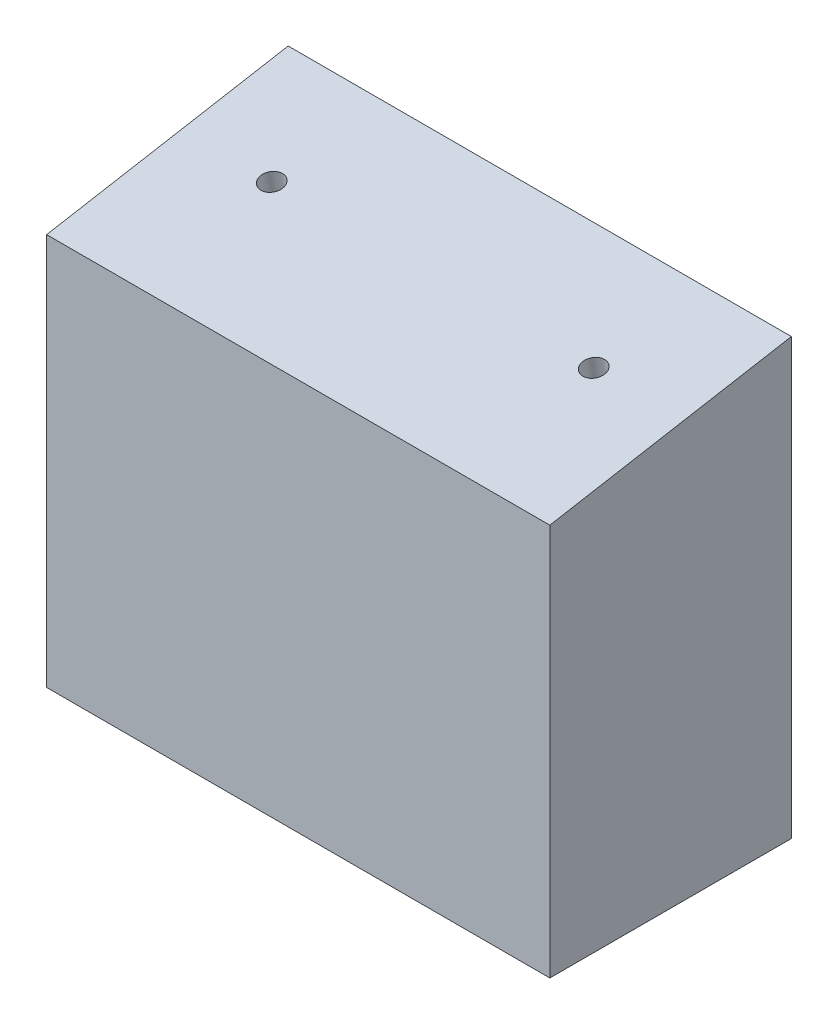
ISO-10303-21;
HEADER;
FILE_DESCRIPTION(('STEP AP214'),'2;1');
FILE_NAME('part.step','',(''),(''),'','','');
FILE_SCHEMA(('AUTOMOTIVE_DESIGN { 1 0 10303 214 1 1 1 1 }'));
ENDSEC;
DATA;
#1=APPLICATION_CONTEXT('core data for automotive mechanical design processes');
#2=APPLICATION_PROTOCOL_DEFINITION('international standard','automotive_design',2000,#1);
#3=PRODUCT_CONTEXT('',#1,'mechanical');
#4=PRODUCT('Part','Part','',(#3));
#5=PRODUCT_RELATED_PRODUCT_CATEGORY('part','',(#4));
#6=PRODUCT_DEFINITION_FORMATION('','',#4);
#7=PRODUCT_DEFINITION_CONTEXT('part definition',#1,'design');
#8=PRODUCT_DEFINITION('design','',#6,#7);
#9=PRODUCT_DEFINITION_SHAPE('','',#8);
#10=(LENGTH_UNIT() NAMED_UNIT(*) SI_UNIT(.MILLI.,.METRE.));
#11=(NAMED_UNIT(*) PLANE_ANGLE_UNIT() SI_UNIT($,.RADIAN.));
#12=(NAMED_UNIT(*) SI_UNIT($,.STERADIAN.) SOLID_ANGLE_UNIT());
#13=UNCERTAINTY_MEASURE_WITH_UNIT(LENGTH_MEASURE(1.E-05),#10,'distance_accuracy_value','');
#14=(GEOMETRIC_REPRESENTATION_CONTEXT(3) GLOBAL_UNCERTAINTY_ASSIGNED_CONTEXT((#13)) GLOBAL_UNIT_ASSIGNED_CONTEXT((#10,
#11,#12)) REPRESENTATION_CONTEXT('',''));
#15=CARTESIAN_POINT('',(0.,0.,0.));
#16=DIRECTION('',(0.,0.,1.));
#17=DIRECTION('',(1.,0.,0.));
#18=AXIS2_PLACEMENT_3D('',#15,#16,#17);
#19=CARTESIAN_POINT('',(39.6875,61.8619420350078,0.));
#20=DIRECTION('',(0.,0.,-1.));
#21=DIRECTION('',(0.,1.,0.));
#22=AXIS2_PLACEMENT_3D('',#19,#20,#21);
#23=PLANE('',#22);
#24=DIRECTION('',(0.,-1.,0.));
#25=VECTOR('',#24,1.);
#26=CARTESIAN_POINT('',(-39.6875,61.8619420350078,0.));
#27=LINE('',#26,#25);
#28=CARTESIAN_POINT('',(-39.6875,61.8619420350078,0.));
#29=VERTEX_POINT('',#28);
#30=CARTESIAN_POINT('',(-39.6875,0.,0.));
#31=VERTEX_POINT('',#30);
#32=EDGE_CURVE('E142',#29,#31,#27,.T.);
#33=ORIENTED_EDGE('',*,*,#32,.T.);
#34=DIRECTION('',(-1.,0.,0.));
#35=VECTOR('',#34,1.);
#36=CARTESIAN_POINT('',(39.6875,0.,0.));
#37=LINE('',#36,#35);
#38=CARTESIAN_POINT('',(39.6875,0.,0.));
#39=VERTEX_POINT('',#38);
#40=EDGE_CURVE('E13',#39,#31,#37,.T.);
#41=ORIENTED_EDGE('',*,*,#40,.F.);
#42=DIRECTION('',(0.,-1.,0.));
#43=VECTOR('',#42,1.);
#44=CARTESIAN_POINT('',(39.6875,61.8619420350078,0.));
#45=LINE('',#44,#43);
#46=CARTESIAN_POINT('',(39.6875,61.8619420350078,0.));
#47=VERTEX_POINT('',#46);
#48=EDGE_CURVE('E143',#47,#39,#45,.T.);
#49=ORIENTED_EDGE('',*,*,#48,.F.);
#50=DIRECTION('',(-1.,0.,0.));
#51=VECTOR('',#50,1.);
#52=CARTESIAN_POINT('',(39.6875,61.8619420350078,0.));
#53=LINE('',#52,#51);
#54=EDGE_CURVE('E149',#47,#29,#53,.T.);
#55=ORIENTED_EDGE('',*,*,#54,.T.);
#56=EDGE_LOOP('',(#33,#41,#49,#55));
#57=FACE_BOUND('',#56,.T.);
#58=ADVANCED_FACE('F49',(#57),#23,.F.);
#59=CARTESIAN_POINT('',(39.6875,0.,0.));
#60=DIRECTION('',(0.,1.,0.));
#61=DIRECTION('',(0.,0.,1.));
#62=AXIS2_PLACEMENT_3D('',#59,#60,#61);
#63=PLANE('',#62);
#64=CARTESIAN_POINT('',(-25.4,0.,-19.05));
#65=DIRECTION('',(0.,-1.,0.));
#66=DIRECTION('',(0.,0.,-1.));
#67=AXIS2_PLACEMENT_3D('',#64,#65,#66);
#68=CIRCLE('',#67,2.55269999999999);
#69=CARTESIAN_POINT('',(-25.4,0.,-21.6027));
#70=VERTEX_POINT('',#69);
#71=EDGE_CURVE('E130',#70,#70,#68,.T.);
#72=ORIENTED_EDGE('',*,*,#71,.F.);
#73=EDGE_LOOP('',(#72));
#74=FACE_BOUND('',#73,.T.);
#75=CARTESIAN_POINT('',(25.4,0.,-19.05));
#76=DIRECTION('',(0.,-1.,0.));
#77=DIRECTION('',(0.,0.,-1.));
#78=AXIS2_PLACEMENT_3D('',#75,#76,#77);
#79=CIRCLE('',#78,2.55269999999999);
#80=CARTESIAN_POINT('',(25.4,0.,-21.6027));
#81=VERTEX_POINT('',#80);
#82=EDGE_CURVE('E136',#81,#81,#79,.T.);
#83=ORIENTED_EDGE('',*,*,#82,.F.);
#84=EDGE_LOOP('',(#83));
#85=FACE_BOUND('',#84,.T.);
#86=DIRECTION('',(0.,0.,-1.));
#87=VECTOR('',#86,1.);
#88=CARTESIAN_POINT('',(-39.6875,0.,0.));
#89=LINE('',#88,#87);
#90=CARTESIAN_POINT('',(-39.6875,0.,-38.1));
#91=VERTEX_POINT('',#90);
#92=EDGE_CURVE('E152',#31,#91,#89,.T.);
#93=ORIENTED_EDGE('',*,*,#92,.T.);
#94=DIRECTION('',(-1.,0.,0.));
#95=VECTOR('',#94,1.);
#96=CARTESIAN_POINT('',(39.6875,0.,-38.1));
#97=LINE('',#96,#95);
#98=CARTESIAN_POINT('',(39.6875,0.,-38.1));
#99=VERTEX_POINT('',#98);
#100=EDGE_CURVE('E57',#99,#91,#97,.T.);
#101=ORIENTED_EDGE('',*,*,#100,.F.);
#102=DIRECTION('',(0.,0.,-1.));
#103=VECTOR('',#102,1.);
#104=CARTESIAN_POINT('',(39.6875,0.,0.));
#105=LINE('',#104,#103);
#106=EDGE_CURVE('E96',#39,#99,#105,.T.);
#107=ORIENTED_EDGE('',*,*,#106,.F.);
#108=ORIENTED_EDGE('',*,*,#40,.T.);
#109=EDGE_LOOP('',(#93,#101,#107,#108));
#110=FACE_BOUND('',#109,.T.);
#111=ADVANCED_FACE('F176',(#74,#85,#110),#63,.F.);
#112=CARTESIAN_POINT('',(39.6875,0.,-38.1));
#113=DIRECTION('',(0.,0.,1.));
#114=DIRECTION('',(0.,-1.,0.));
#115=AXIS2_PLACEMENT_3D('',#112,#113,#114);
#116=PLANE('',#115);
#117=DIRECTION('',(0.,1.,0.));
#118=VECTOR('',#117,1.);
#119=CARTESIAN_POINT('',(-39.6875,0.,-38.1));
#120=LINE('',#119,#118);
#121=CARTESIAN_POINT('',(-39.6875,68.58,-38.1));
#122=VERTEX_POINT('',#121);
#123=EDGE_CURVE('E83',#91,#122,#120,.T.);
#124=ORIENTED_EDGE('',*,*,#123,.T.);
#125=DIRECTION('',(-1.,0.,0.));
#126=VECTOR('',#125,1.);
#127=CARTESIAN_POINT('',(39.6875,68.58,-38.1));
#128=LINE('',#127,#126);
#129=CARTESIAN_POINT('',(39.6875,68.58,-38.1));
#130=VERTEX_POINT('',#129);
#131=EDGE_CURVE('E157',#130,#122,#128,.T.);
#132=ORIENTED_EDGE('',*,*,#131,.F.);
#133=DIRECTION('',(0.,1.,0.));
#134=VECTOR('',#133,1.);
#135=CARTESIAN_POINT('',(39.6875,0.,-38.1));
#136=LINE('',#135,#134);
#137=EDGE_CURVE('E146',#99,#130,#136,.T.);
#138=ORIENTED_EDGE('',*,*,#137,.F.);
#139=ORIENTED_EDGE('',*,*,#100,.T.);
#140=EDGE_LOOP('',(#124,#132,#138,#139));
#141=FACE_BOUND('',#140,.T.);
#142=ADVANCED_FACE('F159',(#141),#116,.F.);
#143=CARTESIAN_POINT('',(39.6875,68.58,-38.1));
#144=DIRECTION('',(0.,-0.984807753012209,-0.173648177666924));
#145=DIRECTION('',(0.,0.173648177666924,-0.984807753012209));
#146=AXIS2_PLACEMENT_3D('',#143,#144,#145);
#147=PLANE('',#146);
#148=CARTESIAN_POINT('',(-25.4,65.6028019939006,-21.2154710746057));
#149=DIRECTION('',(0.,0.984807753012209,0.173648177666923));
#150=DIRECTION('',(0.,-0.173648177666923,0.984807753012209));
#151=AXIS2_PLACEMENT_3D('',#148,#149,#150);
#152=CIRCLE('',#151,1.72719999999999);
#153=CARTESIAN_POINT('',(-25.4,65.3028768614343,-19.514511123603));
#154=VERTEX_POINT('',#153);
#155=EDGE_CURVE('E120',#154,#154,#152,.T.);
#156=ORIENTED_EDGE('',*,*,#155,.F.);
#157=EDGE_LOOP('',(#156));
#158=FACE_BOUND('',#157,.T.);
#159=CARTESIAN_POINT('',(25.4,65.6028019939006,-21.2154710746057));
#160=DIRECTION('',(0.,0.984807753012209,0.173648177666923));
#161=DIRECTION('',(0.,-0.173648177666923,0.984807753012209));
#162=AXIS2_PLACEMENT_3D('',#159,#160,#161);
#163=CIRCLE('',#162,1.72719999999999);
#164=CARTESIAN_POINT('',(25.4,65.3028768614343,-19.514511123603));
#165=VERTEX_POINT('',#164);
#166=EDGE_CURVE('E119',#165,#165,#163,.T.);
#167=ORIENTED_EDGE('',*,*,#166,.F.);
#168=EDGE_LOOP('',(#167));
#169=FACE_BOUND('',#168,.T.);
#170=DIRECTION('',(0.,-0.173648177666924,0.984807753012209));
#171=VECTOR('',#170,1.);
#172=CARTESIAN_POINT('',(-39.6875,68.58,-38.1));
#173=LINE('',#172,#171);
#174=EDGE_CURVE('E89',#122,#29,#173,.T.);
#175=ORIENTED_EDGE('',*,*,#174,.T.);
#176=ORIENTED_EDGE('',*,*,#54,.F.);
#177=DIRECTION('',(0.,-0.173648177666924,0.984807753012209));
#178=VECTOR('',#177,1.);
#179=CARTESIAN_POINT('',(39.6875,68.58,-38.1));
#180=LINE('',#179,#178);
#181=EDGE_CURVE('E65',#130,#47,#180,.T.);
#182=ORIENTED_EDGE('',*,*,#181,.F.);
#183=ORIENTED_EDGE('',*,*,#131,.T.);
#184=EDGE_LOOP('',(#175,#176,#182,#183));
#185=FACE_BOUND('',#184,.T.);
#186=ADVANCED_FACE('F166',(#158,#169,#185),#147,.F.);
#187=CARTESIAN_POINT('',(39.6875,0.,0.));
#188=DIRECTION('',(1.,0.,0.));
#189=DIRECTION('',(0.,0.,-1.));
#190=AXIS2_PLACEMENT_3D('',#187,#188,#189);
#191=PLANE('',#190);
#192=ORIENTED_EDGE('',*,*,#48,.T.);
#193=ORIENTED_EDGE('',*,*,#106,.T.);
#194=ORIENTED_EDGE('',*,*,#137,.T.);
#195=ORIENTED_EDGE('',*,*,#181,.T.);
#196=EDGE_LOOP('',(#192,#193,#194,#195));
#197=FACE_BOUND('',#196,.T.);
#198=ADVANCED_FACE('F168',(#197),#191,.T.);
#199=CARTESIAN_POINT('',(-39.6875,0.,0.));
#200=DIRECTION('',(1.,0.,0.));
#201=DIRECTION('',(0.,0.,-1.));
#202=AXIS2_PLACEMENT_3D('',#199,#200,#201);
#203=PLANE('',#202);
#204=ORIENTED_EDGE('',*,*,#32,.F.);
#205=ORIENTED_EDGE('',*,*,#174,.F.);
#206=ORIENTED_EDGE('',*,*,#123,.F.);
#207=ORIENTED_EDGE('',*,*,#92,.F.);
#208=EDGE_LOOP('',(#204,#205,#206,#207));
#209=FACE_BOUND('',#208,.T.);
#210=ADVANCED_FACE('F162',(#209),#203,.F.);
#211=CARTESIAN_POINT('',(25.4,22.86,-19.05));
#212=DIRECTION('',(0.,-1.,0.));
#213=DIRECTION('',(0.,0.,-1.));
#214=AXIS2_PLACEMENT_3D('',#211,#212,#213);
#215=CONICAL_SURFACE('',#214,2.55269999999999,1.02974425867665);
#216=CARTESIAN_POINT('',(25.4,24.3938169021917,-19.05));
#217=VERTEX_POINT('',#216);
#218=VERTEX_LOOP('',#217);
#219=FACE_BOUND('',#218,.T.);
#220=CARTESIAN_POINT('',(25.4,22.86,-19.05));
#221=DIRECTION('',(0.,-1.,0.));
#222=DIRECTION('',(0.,0.,-1.));
#223=AXIS2_PLACEMENT_3D('',#220,#221,#222);
#224=CIRCLE('',#223,2.55269999999999);
#225=CARTESIAN_POINT('',(25.4,22.86,-21.6027));
#226=VERTEX_POINT('',#225);
#227=EDGE_CURVE('E139',#226,#226,#224,.T.);
#228=ORIENTED_EDGE('',*,*,#227,.T.);
#229=EDGE_LOOP('',(#228));
#230=FACE_BOUND('',#229,.T.);
#231=ADVANCED_FACE('F195',(#219,#230),#215,.F.);
#232=CARTESIAN_POINT('',(25.4,0.,-19.05));
#233=DIRECTION('',(0.,-1.,0.));
#234=DIRECTION('',(0.,0.,-1.));
#235=AXIS2_PLACEMENT_3D('',#232,#233,#234);
#236=CYLINDRICAL_SURFACE('',#235,2.55269999999999);
#237=ORIENTED_EDGE('',*,*,#227,.F.);
#238=EDGE_LOOP('',(#237));
#239=FACE_BOUND('',#238,.T.);
#240=ORIENTED_EDGE('',*,*,#82,.T.);
#241=EDGE_LOOP('',(#240));
#242=FACE_BOUND('',#241,.T.);
#243=ADVANCED_FACE('F192',(#239,#242),#236,.F.);
#244=CARTESIAN_POINT('',(-25.4,22.86,-19.05));
#245=DIRECTION('',(0.,-1.,0.));
#246=DIRECTION('',(0.,0.,-1.));
#247=AXIS2_PLACEMENT_3D('',#244,#245,#246);
#248=CONICAL_SURFACE('',#247,2.55269999999999,1.02974425867665);
#249=CARTESIAN_POINT('',(-25.4,24.3938169021917,-19.05));
#250=VERTEX_POINT('',#249);
#251=VERTEX_LOOP('',#250);
#252=FACE_BOUND('',#251,.T.);
#253=CARTESIAN_POINT('',(-25.4,22.86,-19.05));
#254=DIRECTION('',(0.,-1.,0.));
#255=DIRECTION('',(0.,0.,-1.));
#256=AXIS2_PLACEMENT_3D('',#253,#254,#255);
#257=CIRCLE('',#256,2.55269999999999);
#258=CARTESIAN_POINT('',(-25.4,22.86,-21.6027));
#259=VERTEX_POINT('',#258);
#260=EDGE_CURVE('E133',#259,#259,#257,.T.);
#261=ORIENTED_EDGE('',*,*,#260,.T.);
#262=EDGE_LOOP('',(#261));
#263=FACE_BOUND('',#262,.T.);
#264=ADVANCED_FACE('F194',(#252,#263),#248,.F.);
#265=CARTESIAN_POINT('',(-25.4,0.,-19.05));
#266=DIRECTION('',(0.,-1.,0.));
#267=DIRECTION('',(0.,0.,-1.));
#268=AXIS2_PLACEMENT_3D('',#265,#266,#267);
#269=CYLINDRICAL_SURFACE('',#268,2.55269999999999);
#270=ORIENTED_EDGE('',*,*,#260,.F.);
#271=EDGE_LOOP('',(#270));
#272=FACE_BOUND('',#271,.T.);
#273=ORIENTED_EDGE('',*,*,#71,.T.);
#274=EDGE_LOOP('',(#273));
#275=FACE_BOUND('',#274,.T.);
#276=ADVANCED_FACE('F202',(#272,#275),#269,.F.);
#277=CARTESIAN_POINT('',(25.4,50.8444730072596,-23.8177626651222));
#278=DIRECTION('',(0.,0.984807753012209,0.173648177666923));
#279=DIRECTION('',(0.,-0.173648177666923,0.984807753012209));
#280=AXIS2_PLACEMENT_3D('',#277,#278,#279);
#281=CONICAL_SURFACE('',#280,1.7272,1.02974425867665);
#282=CARTESIAN_POINT('',(25.4,49.8224331581591,-23.9979758658778));
#283=VERTEX_POINT('',#282);
#284=VERTEX_LOOP('',#283);
#285=FACE_BOUND('',#284,.T.);
#286=CARTESIAN_POINT('',(25.4,50.8444730072596,-23.8177626651222));
#287=DIRECTION('',(0.,0.984807753012209,0.173648177666923));
#288=DIRECTION('',(0.,-0.173648177666923,0.984807753012209));
#289=AXIS2_PLACEMENT_3D('',#286,#287,#288);
#290=CIRCLE('',#289,1.7272);
#291=CARTESIAN_POINT('',(25.4,50.5445478747933,-22.1168027141195));
#292=VERTEX_POINT('',#291);
#293=EDGE_CURVE('E123',#292,#292,#290,.T.);
#294=ORIENTED_EDGE('',*,*,#293,.T.);
#295=EDGE_LOOP('',(#294));
#296=FACE_BOUND('',#295,.T.);
#297=ADVANCED_FACE('F243',(#285,#296),#281,.F.);
#298=CARTESIAN_POINT('',(25.4,65.6028019939006,-21.2154710746057));
#299=DIRECTION('',(0.,0.984807753012209,0.173648177666923));
#300=DIRECTION('',(0.,-0.173648177666923,0.984807753012209));
#301=AXIS2_PLACEMENT_3D('',#298,#299,#300);
#302=CYLINDRICAL_SURFACE('',#301,1.7272);
#303=ORIENTED_EDGE('',*,*,#293,.F.);
#304=EDGE_LOOP('',(#303));
#305=FACE_BOUND('',#304,.T.);
#306=ORIENTED_EDGE('',*,*,#166,.T.);
#307=EDGE_LOOP('',(#306));
#308=FACE_BOUND('',#307,.T.);
#309=ADVANCED_FACE('F113',(#305,#308),#302,.F.);
#310=CARTESIAN_POINT('',(-25.4,50.8444730072596,-23.8177626651222));
#311=DIRECTION('',(0.,0.984807753012209,0.173648177666923));
#312=DIRECTION('',(0.,-0.173648177666923,0.984807753012209));
#313=AXIS2_PLACEMENT_3D('',#310,#311,#312);
#314=CONICAL_SURFACE('',#313,1.7272,1.02974425867665);
#315=CARTESIAN_POINT('',(-25.4,49.8224331581591,-23.9979758658778));
#316=VERTEX_POINT('',#315);
#317=VERTEX_LOOP('',#316);
#318=FACE_BOUND('',#317,.T.);
#319=CARTESIAN_POINT('',(-25.4,50.8444730072596,-23.8177626651222));
#320=DIRECTION('',(0.,0.984807753012209,0.173648177666923));
#321=DIRECTION('',(0.,-0.173648177666923,0.984807753012209));
#322=AXIS2_PLACEMENT_3D('',#319,#320,#321);
#323=CIRCLE('',#322,1.7272);
#324=CARTESIAN_POINT('',(-25.4,50.5445478747933,-22.1168027141195));
#325=VERTEX_POINT('',#324);
#326=EDGE_CURVE('E117',#325,#325,#323,.T.);
#327=ORIENTED_EDGE('',*,*,#326,.T.);
#328=EDGE_LOOP('',(#327));
#329=FACE_BOUND('',#328,.T.);
#330=ADVANCED_FACE('F109',(#318,#329),#314,.F.);
#331=CARTESIAN_POINT('',(-25.4,65.6028019939006,-21.2154710746057));
#332=DIRECTION('',(0.,0.984807753012209,0.173648177666923));
#333=DIRECTION('',(0.,-0.173648177666923,0.984807753012209));
#334=AXIS2_PLACEMENT_3D('',#331,#332,#333);
#335=CYLINDRICAL_SURFACE('',#334,1.7272);
#336=ORIENTED_EDGE('',*,*,#326,.F.);
#337=EDGE_LOOP('',(#336));
#338=FACE_BOUND('',#337,.T.);
#339=ORIENTED_EDGE('',*,*,#155,.T.);
#340=EDGE_LOOP('',(#339));
#341=FACE_BOUND('',#340,.T.);
#342=ADVANCED_FACE('F112',(#338,#341),#335,.F.);
#343=CLOSED_SHELL('',(#58,#111,#142,#186,#198,#210,#231,#243,#264,#276,#297,#309,#330,#342));
#344=MANIFOLD_SOLID_BREP('B2',#343);
#345=ADVANCED_BREP_SHAPE_REPRESENTATION('',(#18,#344),#14);
#346=SHAPE_DEFINITION_REPRESENTATION(#9,#345);
ENDSEC;
END-ISO-10303-21;
